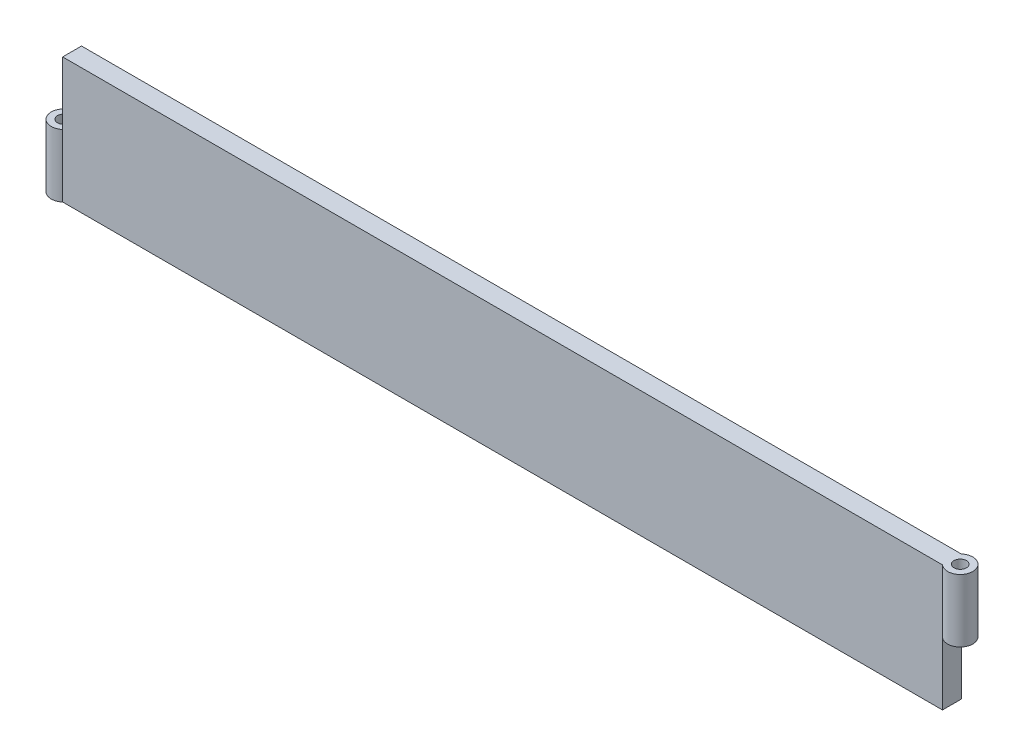
ISO-10303-21;
HEADER;
FILE_DESCRIPTION(('STEP AP214'),'2;1');
FILE_NAME('part.step','',(''),(''),'','','');
FILE_SCHEMA(('AUTOMOTIVE_DESIGN { 1 0 10303 214 1 1 1 1 }'));
ENDSEC;
DATA;
#1=APPLICATION_CONTEXT('core data for automotive mechanical design processes');
#2=APPLICATION_PROTOCOL_DEFINITION('international standard','automotive_design',2000,#1);
#3=PRODUCT_CONTEXT('',#1,'mechanical');
#4=PRODUCT('Part','Part','',(#3));
#5=PRODUCT_RELATED_PRODUCT_CATEGORY('part','',(#4));
#6=PRODUCT_DEFINITION_FORMATION('','',#4);
#7=PRODUCT_DEFINITION_CONTEXT('part definition',#1,'design');
#8=PRODUCT_DEFINITION('design','',#6,#7);
#9=PRODUCT_DEFINITION_SHAPE('','',#8);
#10=(LENGTH_UNIT() NAMED_UNIT(*) SI_UNIT(.MILLI.,.METRE.));
#11=(NAMED_UNIT(*) PLANE_ANGLE_UNIT() SI_UNIT($,.RADIAN.));
#12=(NAMED_UNIT(*) SI_UNIT($,.STERADIAN.) SOLID_ANGLE_UNIT());
#13=UNCERTAINTY_MEASURE_WITH_UNIT(LENGTH_MEASURE(1.E-05),#10,'distance_accuracy_value','');
#14=(GEOMETRIC_REPRESENTATION_CONTEXT(3) GLOBAL_UNCERTAINTY_ASSIGNED_CONTEXT((#13)) GLOBAL_UNIT_ASSIGNED_CONTEXT((#10,
#11,#12)) REPRESENTATION_CONTEXT('',''));
#15=CARTESIAN_POINT('',(0.,0.,0.));
#16=DIRECTION('',(0.,0.,1.));
#17=DIRECTION('',(1.,0.,0.));
#18=AXIS2_PLACEMENT_3D('',#15,#16,#17);
#19=CARTESIAN_POINT('',(-25284.5528455285,8821.13821138211,3.));
#20=DIRECTION('',(1.,1.77635683940029E-13,0.));
#21=DIRECTION('',(-1.77635683940029E-13,1.,0.));
#22=AXIS2_PLACEMENT_3D('',#19,#20,#21);
#23=PLANE('',#22);
#24=DIRECTION('',(0.,0.,-1.));
#25=VECTOR('',#24,1.);
#26=CARTESIAN_POINT('',(-25284.5528455285,8811.13821138211,3.));
#27=LINE('',#26,#25);
#28=CARTESIAN_POINT('',(-25284.5528455285,8811.13821138211,3.));
#29=VERTEX_POINT('',#28);
#30=CARTESIAN_POINT('',(-25284.5528455285,8811.13821138211,0.));
#31=VERTEX_POINT('',#30);
#32=EDGE_CURVE('E48',#29,#31,#27,.T.);
#33=ORIENTED_EDGE('',*,*,#32,.F.);
#34=DIRECTION('',(1.77635683940029E-13,-1.,0.));
#35=VECTOR('',#34,1.);
#36=CARTESIAN_POINT('',(-25284.5528455285,8821.13821138211,3.));
#37=LINE('',#36,#35);
#38=CARTESIAN_POINT('',(-25284.5528455285,8821.13821138211,3.));
#39=VERTEX_POINT('',#38);
#40=EDGE_CURVE('E144',#39,#29,#37,.T.);
#41=ORIENTED_EDGE('',*,*,#40,.F.);
#42=DIRECTION('',(0.,0.,-1.));
#43=VECTOR('',#42,1.);
#44=CARTESIAN_POINT('',(-25284.5528455285,8821.13821138211,3.));
#45=LINE('',#44,#43);
#46=CARTESIAN_POINT('',(-25284.5528455285,8821.13821138211,0.));
#47=VERTEX_POINT('',#46);
#48=EDGE_CURVE('E11',#39,#47,#45,.T.);
#49=ORIENTED_EDGE('',*,*,#48,.T.);
#50=DIRECTION('',(1.77635683940029E-13,-1.,0.));
#51=VECTOR('',#50,1.);
#52=CARTESIAN_POINT('',(-25284.5528455285,8821.13821138211,0.));
#53=LINE('',#52,#51);
#54=EDGE_CURVE('E95',#47,#31,#53,.T.);
#55=ORIENTED_EDGE('',*,*,#54,.T.);
#56=EDGE_LOOP('',(#33,#41,#49,#55));
#57=FACE_BOUND('',#56,.T.);
#58=ADVANCED_FACE('F33',(#57),#23,.F.);
#59=CARTESIAN_POINT('',(-25144.5528455285,8821.13821138211,3.));
#60=DIRECTION('',(-1.,-1.77635683940029E-13,0.));
#61=DIRECTION('',(1.77635683940029E-13,-1.,0.));
#62=AXIS2_PLACEMENT_3D('',#59,#60,#61);
#63=PLANE('',#62);
#64=DIRECTION('',(-1.77635683940029E-13,1.,0.));
#65=VECTOR('',#64,1.);
#66=CARTESIAN_POINT('',(-25144.5528455285,8821.13821138211,0.));
#67=LINE('',#66,#65);
#68=CARTESIAN_POINT('',(-25144.5528455285,8801.13821138211,0.));
#69=VERTEX_POINT('',#68);
#70=CARTESIAN_POINT('',(-25144.5528455285,8811.13821138211,0.));
#71=VERTEX_POINT('',#70);
#72=EDGE_CURVE('E89',#69,#71,#67,.T.);
#73=ORIENTED_EDGE('',*,*,#72,.T.);
#74=DIRECTION('',(0.,0.,1.));
#75=VECTOR('',#74,1.);
#76=CARTESIAN_POINT('',(-25144.5528455285,8811.13821138211,3.));
#77=LINE('',#76,#75);
#78=CARTESIAN_POINT('',(-25144.5528455285,8811.13821138211,3.));
#79=VERTEX_POINT('',#78);
#80=EDGE_CURVE('E132',#71,#79,#77,.T.);
#81=ORIENTED_EDGE('',*,*,#80,.T.);
#82=DIRECTION('',(-1.77635683940029E-13,1.,0.));
#83=VECTOR('',#82,1.);
#84=CARTESIAN_POINT('',(-25144.5528455285,8821.13821138211,3.));
#85=LINE('',#84,#83);
#86=CARTESIAN_POINT('',(-25144.5528455285,8801.13821138211,3.));
#87=VERTEX_POINT('',#86);
#88=EDGE_CURVE('E94',#87,#79,#85,.T.);
#89=ORIENTED_EDGE('',*,*,#88,.F.);
#90=DIRECTION('',(0.,0.,-1.));
#91=VECTOR('',#90,1.);
#92=CARTESIAN_POINT('',(-25144.5528455285,8801.13821138211,3.));
#93=LINE('',#92,#91);
#94=EDGE_CURVE('E41',#87,#69,#93,.T.);
#95=ORIENTED_EDGE('',*,*,#94,.T.);
#96=EDGE_LOOP('',(#73,#81,#89,#95));
#97=FACE_BOUND('',#96,.T.);
#98=ADVANCED_FACE('F35',(#97),#63,.F.);
#99=CARTESIAN_POINT('',(-25284.5528455285,8821.13821138211,3.));
#100=DIRECTION('',(0.,-1.,0.));
#101=DIRECTION('',(0.,0.,-1.));
#102=AXIS2_PLACEMENT_3D('',#99,#100,#101);
#103=PLANE('',#102);
#104=DIRECTION('',(-1.,0.,0.));
#105=VECTOR('',#104,1.);
#106=CARTESIAN_POINT('',(-25284.5528455285,8821.13821138211,3.));
#107=LINE('',#106,#105);
#108=CARTESIAN_POINT('',(-25144.5528455285,8821.13821138211,3.));
#109=VERTEX_POINT('',#108);
#110=EDGE_CURVE('E142',#109,#39,#107,.T.);
#111=ORIENTED_EDGE('',*,*,#110,.F.);
#112=CARTESIAN_POINT('',(-25143.2299698729,8821.13821138211,1.5));
#113=DIRECTION('',(0.,1.,0.));
#114=DIRECTION('',(0.,0.,-1.));
#115=AXIS2_PLACEMENT_3D('',#112,#113,#114);
#116=CIRCLE('',#115,2.00000000000001);
#117=CARTESIAN_POINT('',(-25144.5528455285,8821.13821138211,0.));
#118=VERTEX_POINT('',#117);
#119=EDGE_CURVE('E126',#109,#118,#116,.T.);
#120=ORIENTED_EDGE('',*,*,#119,.T.);
#121=DIRECTION('',(-1.,0.,0.));
#122=VECTOR('',#121,1.);
#123=CARTESIAN_POINT('',(-25284.5528455285,8821.13821138211,0.));
#124=LINE('',#123,#122);
#125=EDGE_CURVE('E105',#118,#47,#124,.T.);
#126=ORIENTED_EDGE('',*,*,#125,.T.);
#127=ORIENTED_EDGE('',*,*,#48,.F.);
#128=EDGE_LOOP('',(#111,#120,#126,#127));
#129=FACE_BOUND('',#128,.T.);
#130=CARTESIAN_POINT('',(-25143.2299698729,8821.13821138211,1.5));
#131=DIRECTION('',(0.,1.,0.));
#132=DIRECTION('',(0.,0.,-1.));
#133=AXIS2_PLACEMENT_3D('',#130,#131,#132);
#134=CIRCLE('',#133,1.00000000000016);
#135=CARTESIAN_POINT('',(-25143.2299698729,8821.13821138211,0.499999999999844));
#136=VERTEX_POINT('',#135);
#137=EDGE_CURVE('E122',#136,#136,#134,.T.);
#138=ORIENTED_EDGE('',*,*,#137,.F.);
#139=EDGE_LOOP('',(#138));
#140=FACE_BOUND('',#139,.T.);
#141=ADVANCED_FACE('F177',(#129,#140),#103,.F.);
#142=CARTESIAN_POINT('',(-25284.5528455285,8801.13821138211,3.));
#143=DIRECTION('',(0.,1.,0.));
#144=DIRECTION('',(0.,0.,1.));
#145=AXIS2_PLACEMENT_3D('',#142,#143,#144);
#146=PLANE('',#145);
#147=DIRECTION('',(1.,0.,0.));
#148=VECTOR('',#147,1.);
#149=CARTESIAN_POINT('',(-25284.5528455285,8801.13821138211,3.));
#150=LINE('',#149,#148);
#151=CARTESIAN_POINT('',(-25284.5528455285,8801.13821138211,3.));
#152=VERTEX_POINT('',#151);
#153=EDGE_CURVE('E110',#152,#87,#150,.T.);
#154=ORIENTED_EDGE('',*,*,#153,.F.);
#155=CARTESIAN_POINT('',(-25285.875721184,8801.13821138211,1.5));
#156=DIRECTION('',(0.,-1.,0.));
#157=DIRECTION('',(0.,0.,-1.));
#158=AXIS2_PLACEMENT_3D('',#155,#156,#157);
#159=CIRCLE('',#158,2.00000000000001);
#160=CARTESIAN_POINT('',(-25284.5528455285,8801.13821138211,0.));
#161=VERTEX_POINT('',#160);
#162=EDGE_CURVE('E102',#152,#161,#159,.T.);
#163=ORIENTED_EDGE('',*,*,#162,.T.);
#164=DIRECTION('',(1.,0.,0.));
#165=VECTOR('',#164,1.);
#166=CARTESIAN_POINT('',(-25284.5528455285,8801.13821138211,0.));
#167=LINE('',#166,#165);
#168=EDGE_CURVE('E86',#161,#69,#167,.T.);
#169=ORIENTED_EDGE('',*,*,#168,.T.);
#170=ORIENTED_EDGE('',*,*,#94,.F.);
#171=EDGE_LOOP('',(#154,#163,#169,#170));
#172=FACE_BOUND('',#171,.T.);
#173=CARTESIAN_POINT('',(-25285.875721184,8801.13821138211,1.5));
#174=DIRECTION('',(0.,-1.,0.));
#175=DIRECTION('',(0.,0.,-1.));
#176=AXIS2_PLACEMENT_3D('',#173,#174,#175);
#177=CIRCLE('',#176,1.00000000000016);
#178=CARTESIAN_POINT('',(-25285.875721184,8801.13821138211,0.499999999999844));
#179=VERTEX_POINT('',#178);
#180=EDGE_CURVE('E115',#179,#179,#177,.T.);
#181=ORIENTED_EDGE('',*,*,#180,.F.);
#182=EDGE_LOOP('',(#181));
#183=FACE_BOUND('',#182,.T.);
#184=ADVANCED_FACE('F108',(#172,#183),#146,.F.);
#185=CARTESIAN_POINT('',(0.,0.,3.));
#186=DIRECTION('',(0.,0.,1.));
#187=DIRECTION('',(1.,0.,0.));
#188=AXIS2_PLACEMENT_3D('',#185,#186,#187);
#189=PLANE('',#188);
#190=ORIENTED_EDGE('',*,*,#88,.T.);
#191=DIRECTION('',(0.,1.,0.));
#192=VECTOR('',#191,1.);
#193=CARTESIAN_POINT('',(-25144.5528455285,8811.13821138211,3.));
#194=LINE('',#193,#192);
#195=EDGE_CURVE('E136',#109,#79,#194,.F.);
#196=ORIENTED_EDGE('',*,*,#195,.F.);
#197=ORIENTED_EDGE('',*,*,#110,.T.);
#198=ORIENTED_EDGE('',*,*,#40,.T.);
#199=DIRECTION('',(0.,-1.,0.));
#200=VECTOR('',#199,1.);
#201=CARTESIAN_POINT('',(-25284.5528455285,8811.13821138211,3.));
#202=LINE('',#201,#200);
#203=EDGE_CURVE('E120',#152,#29,#202,.F.);
#204=ORIENTED_EDGE('',*,*,#203,.F.);
#205=ORIENTED_EDGE('',*,*,#153,.T.);
#206=EDGE_LOOP('',(#190,#196,#197,#198,#204,#205));
#207=FACE_BOUND('',#206,.T.);
#208=ADVANCED_FACE('F152',(#207),#189,.T.);
#209=CARTESIAN_POINT('',(0.,0.,0.));
#210=DIRECTION('',(0.,0.,1.));
#211=DIRECTION('',(1.,0.,0.));
#212=AXIS2_PLACEMENT_3D('',#209,#210,#211);
#213=PLANE('',#212);
#214=ORIENTED_EDGE('',*,*,#72,.F.);
#215=ORIENTED_EDGE('',*,*,#168,.F.);
#216=EDGE_CURVE('E56',#31,#161,#53,.T.);
#217=ORIENTED_EDGE('',*,*,#216,.F.);
#218=ORIENTED_EDGE('',*,*,#54,.F.);
#219=ORIENTED_EDGE('',*,*,#125,.F.);
#220=EDGE_CURVE('E139',#71,#118,#67,.T.);
#221=ORIENTED_EDGE('',*,*,#220,.F.);
#222=EDGE_LOOP('',(#214,#215,#217,#218,#219,#221));
#223=FACE_BOUND('',#222,.T.);
#224=ADVANCED_FACE('F87',(#223),#213,.F.);
#225=CARTESIAN_POINT('',(-25143.2299698729,8811.13821138211,1.5));
#226=DIRECTION('',(0.,-1.,0.));
#227=DIRECTION('',(0.,0.,-1.));
#228=AXIS2_PLACEMENT_3D('',#225,#226,#227);
#229=PLANE('',#228);
#230=CARTESIAN_POINT('',(-25143.2299698729,8811.13821138211,1.5));
#231=DIRECTION('',(0.,1.,0.));
#232=DIRECTION('',(0.,0.,-1.));
#233=AXIS2_PLACEMENT_3D('',#230,#231,#232);
#234=CIRCLE('',#233,1.00000000000016);
#235=CARTESIAN_POINT('',(-25143.2299698729,8811.13821138211,0.499999999999844));
#236=VERTEX_POINT('',#235);
#237=EDGE_CURVE('E123',#236,#236,#234,.T.);
#238=ORIENTED_EDGE('',*,*,#237,.T.);
#239=EDGE_LOOP('',(#238));
#240=FACE_BOUND('',#239,.T.);
#241=ORIENTED_EDGE('',*,*,#80,.F.);
#242=CARTESIAN_POINT('',(-25143.2299698729,8811.13821138211,1.5));
#243=DIRECTION('',(0.,1.,0.));
#244=DIRECTION('',(0.,0.,-1.));
#245=AXIS2_PLACEMENT_3D('',#242,#243,#244);
#246=CIRCLE('',#245,2.00000000000001);
#247=EDGE_CURVE('E129',#79,#71,#246,.T.);
#248=ORIENTED_EDGE('',*,*,#247,.F.);
#249=EDGE_LOOP('',(#241,#248));
#250=FACE_BOUND('',#249,.T.);
#251=ADVANCED_FACE('F160',(#240,#250),#229,.T.);
#252=CARTESIAN_POINT('',(-25143.2299698729,8811.13821138211,1.5));
#253=DIRECTION('',(0.,1.,0.));
#254=DIRECTION('',(0.,0.,1.));
#255=AXIS2_PLACEMENT_3D('',#252,#253,#254);
#256=CYLINDRICAL_SURFACE('',#255,2.00000000000001);
#257=ORIENTED_EDGE('',*,*,#119,.F.);
#258=ORIENTED_EDGE('',*,*,#195,.T.);
#259=ORIENTED_EDGE('',*,*,#247,.T.);
#260=ORIENTED_EDGE('',*,*,#220,.T.);
#261=EDGE_LOOP('',(#257,#258,#259,#260));
#262=FACE_BOUND('',#261,.T.);
#263=ADVANCED_FACE('F157',(#262),#256,.T.);
#264=CARTESIAN_POINT('',(-25143.2299698729,8811.13821138211,1.5));
#265=DIRECTION('',(0.,1.,0.));
#266=DIRECTION('',(0.,0.,1.));
#267=AXIS2_PLACEMENT_3D('',#264,#265,#266);
#268=CYLINDRICAL_SURFACE('',#267,1.00000000000016);
#269=ORIENTED_EDGE('',*,*,#237,.F.);
#270=EDGE_LOOP('',(#269));
#271=FACE_BOUND('',#270,.T.);
#272=ORIENTED_EDGE('',*,*,#137,.T.);
#273=EDGE_LOOP('',(#272));
#274=FACE_BOUND('',#273,.T.);
#275=ADVANCED_FACE('F168',(#271,#274),#268,.F.);
#276=CARTESIAN_POINT('',(-25285.875721184,8811.13821138211,1.5));
#277=DIRECTION('',(0.,-1.,0.));
#278=DIRECTION('',(0.,0.,-1.));
#279=AXIS2_PLACEMENT_3D('',#276,#277,#278);
#280=PLANE('',#279);
#281=CARTESIAN_POINT('',(-25285.875721184,8811.13821138211,1.5));
#282=DIRECTION('',(0.,-1.,0.));
#283=DIRECTION('',(0.,0.,-1.));
#284=AXIS2_PLACEMENT_3D('',#281,#282,#283);
#285=CIRCLE('',#284,1.00000000000016);
#286=CARTESIAN_POINT('',(-25285.875721184,8811.13821138211,0.499999999999844));
#287=VERTEX_POINT('',#286);
#288=EDGE_CURVE('E111',#287,#287,#285,.T.);
#289=ORIENTED_EDGE('',*,*,#288,.T.);
#290=EDGE_LOOP('',(#289));
#291=FACE_BOUND('',#290,.T.);
#292=CARTESIAN_POINT('',(-25285.875721184,8811.13821138211,1.5));
#293=DIRECTION('',(0.,-1.,0.));
#294=DIRECTION('',(0.,0.,-1.));
#295=AXIS2_PLACEMENT_3D('',#292,#293,#294);
#296=CIRCLE('',#295,2.00000000000001);
#297=EDGE_CURVE('E104',#29,#31,#296,.T.);
#298=ORIENTED_EDGE('',*,*,#297,.F.);
#299=ORIENTED_EDGE('',*,*,#32,.T.);
#300=EDGE_LOOP('',(#298,#299));
#301=FACE_BOUND('',#300,.T.);
#302=ADVANCED_FACE('F189',(#291,#301),#280,.F.);
#303=CARTESIAN_POINT('',(-25285.875721184,8811.13821138211,1.5));
#304=DIRECTION('',(0.,-1.,0.));
#305=DIRECTION('',(0.,0.,-1.));
#306=AXIS2_PLACEMENT_3D('',#303,#304,#305);
#307=CYLINDRICAL_SURFACE('',#306,2.00000000000001);
#308=ORIENTED_EDGE('',*,*,#162,.F.);
#309=ORIENTED_EDGE('',*,*,#203,.T.);
#310=ORIENTED_EDGE('',*,*,#297,.T.);
#311=ORIENTED_EDGE('',*,*,#216,.T.);
#312=EDGE_LOOP('',(#308,#309,#310,#311));
#313=FACE_BOUND('',#312,.T.);
#314=ADVANCED_FACE('F100',(#313),#307,.T.);
#315=CARTESIAN_POINT('',(-25285.875721184,8811.13821138211,1.5));
#316=DIRECTION('',(0.,-1.,0.));
#317=DIRECTION('',(0.,0.,-1.));
#318=AXIS2_PLACEMENT_3D('',#315,#316,#317);
#319=CYLINDRICAL_SURFACE('',#318,1.00000000000016);
#320=ORIENTED_EDGE('',*,*,#288,.F.);
#321=EDGE_LOOP('',(#320));
#322=FACE_BOUND('',#321,.T.);
#323=ORIENTED_EDGE('',*,*,#180,.T.);
#324=EDGE_LOOP('',(#323));
#325=FACE_BOUND('',#324,.T.);
#326=ADVANCED_FACE('F199',(#322,#325),#319,.F.);
#327=CLOSED_SHELL('',(#58,#98,#141,#184,#208,#224,#251,#263,#275,#302,#314,#326));
#328=MANIFOLD_SOLID_BREP('B2',#327);
#329=ADVANCED_BREP_SHAPE_REPRESENTATION('',(#18,#328),#14);
#330=SHAPE_DEFINITION_REPRESENTATION(#9,#329);
ENDSEC;
END-ISO-10303-21;
